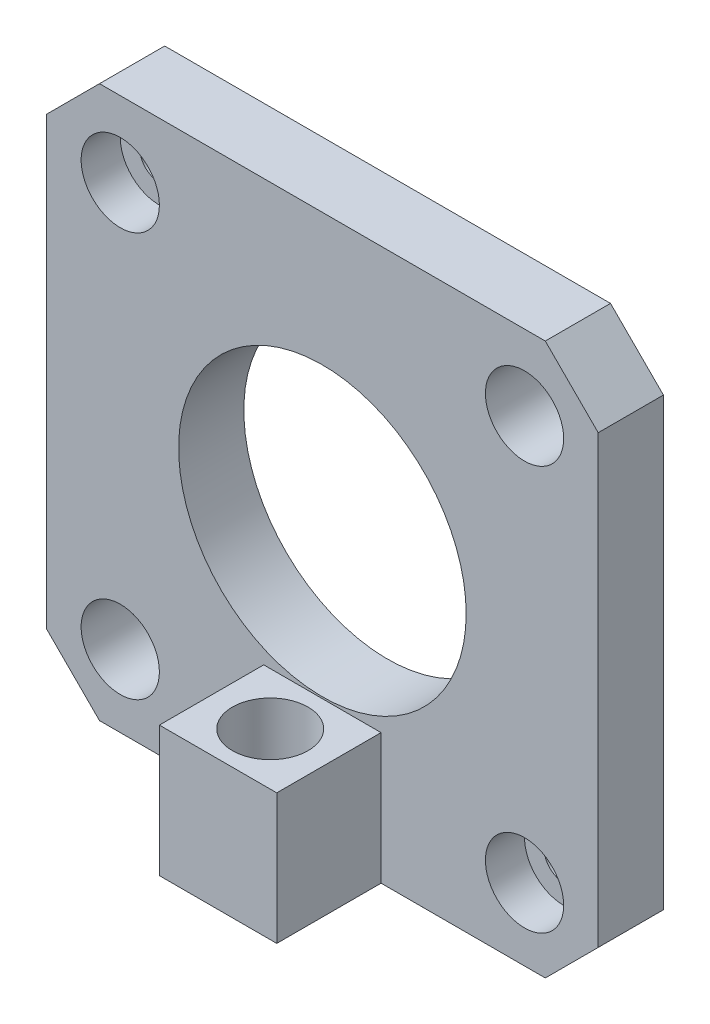
ISO-10303-21;
HEADER;
FILE_DESCRIPTION(('STEP AP214'),'2;1');
FILE_NAME('part.step','',(''),(''),'','','');
FILE_SCHEMA(('AUTOMOTIVE_DESIGN { 1 0 10303 214 1 1 1 1 }'));
ENDSEC;
DATA;
#1=APPLICATION_CONTEXT('core data for automotive mechanical design processes');
#2=APPLICATION_PROTOCOL_DEFINITION('international standard','automotive_design',2000,#1);
#3=PRODUCT_CONTEXT('',#1,'mechanical');
#4=PRODUCT('Part','Part','',(#3));
#5=PRODUCT_RELATED_PRODUCT_CATEGORY('part','',(#4));
#6=PRODUCT_DEFINITION_FORMATION('','',#4);
#7=PRODUCT_DEFINITION_CONTEXT('part definition',#1,'design');
#8=PRODUCT_DEFINITION('design','',#6,#7);
#9=PRODUCT_DEFINITION_SHAPE('','',#8);
#10=(LENGTH_UNIT() NAMED_UNIT(*) SI_UNIT(.MILLI.,.METRE.));
#11=(NAMED_UNIT(*) PLANE_ANGLE_UNIT() SI_UNIT($,.RADIAN.));
#12=(NAMED_UNIT(*) SI_UNIT($,.STERADIAN.) SOLID_ANGLE_UNIT());
#13=UNCERTAINTY_MEASURE_WITH_UNIT(LENGTH_MEASURE(1.E-05),#10,'distance_accuracy_value','');
#14=(GEOMETRIC_REPRESENTATION_CONTEXT(3) GLOBAL_UNCERTAINTY_ASSIGNED_CONTEXT((#13)) GLOBAL_UNIT_ASSIGNED_CONTEXT((#10,
#11,#12)) REPRESENTATION_CONTEXT('',''));
#15=CARTESIAN_POINT('',(0.,0.,0.));
#16=DIRECTION('',(0.,0.,1.));
#17=DIRECTION('',(1.,0.,0.));
#18=AXIS2_PLACEMENT_3D('',#15,#16,#17);
#19=CARTESIAN_POINT('',(-4.01755440247243E-12,-944.312865148015,2916.1615929941));
#20=DIRECTION('',(0.,0.,1.));
#21=DIRECTION('',(1.,0.,0.));
#22=AXIS2_PLACEMENT_3D('',#19,#20,#21);
#23=PLANE('',#22);
#24=CARTESIAN_POINT('',(15.499999999996,-928.812865148015,2916.1615929941));
#25=DIRECTION('',(0.,0.,1.));
#26=DIRECTION('',(1.,0.,0.));
#27=AXIS2_PLACEMENT_3D('',#24,#25,#26);
#28=CIRCLE('',#27,3.);
#29=CARTESIAN_POINT('',(18.499999999996,-928.812865148015,2916.1615929941));
#30=VERTEX_POINT('',#29);
#31=EDGE_CURVE('E240',#30,#30,#28,.T.);
#32=ORIENTED_EDGE('',*,*,#31,.F.);
#33=EDGE_LOOP('',(#32));
#34=FACE_BOUND('',#33,.T.);
#35=CARTESIAN_POINT('',(15.499999999996,-959.812865148015,2916.1615929941));
#36=DIRECTION('',(0.,0.,1.));
#37=DIRECTION('',(1.,0.,0.));
#38=AXIS2_PLACEMENT_3D('',#35,#36,#37);
#39=CIRCLE('',#38,3.);
#40=CARTESIAN_POINT('',(18.499999999996,-959.812865148015,2916.1615929941));
#41=VERTEX_POINT('',#40);
#42=EDGE_CURVE('E247',#41,#41,#39,.T.);
#43=ORIENTED_EDGE('',*,*,#42,.F.);
#44=EDGE_LOOP('',(#43));
#45=FACE_BOUND('',#44,.T.);
#46=CARTESIAN_POINT('',(-15.500000000004,-959.812865148015,2916.1615929941));
#47=DIRECTION('',(0.,0.,1.));
#48=DIRECTION('',(1.,0.,0.));
#49=AXIS2_PLACEMENT_3D('',#46,#47,#48);
#50=CIRCLE('',#49,3.);
#51=CARTESIAN_POINT('',(-12.500000000004,-959.812865148015,2916.1615929941));
#52=VERTEX_POINT('',#51);
#53=EDGE_CURVE('E239',#52,#52,#50,.T.);
#54=ORIENTED_EDGE('',*,*,#53,.F.);
#55=EDGE_LOOP('',(#54));
#56=FACE_BOUND('',#55,.T.);
#57=CARTESIAN_POINT('',(-15.500000000004,-928.812865148015,2916.1615929941));
#58=DIRECTION('',(0.,0.,1.));
#59=DIRECTION('',(1.,0.,0.));
#60=AXIS2_PLACEMENT_3D('',#57,#58,#59);
#61=CIRCLE('',#60,3.);
#62=CARTESIAN_POINT('',(-12.500000000004,-928.812865148015,2916.1615929941));
#63=VERTEX_POINT('',#62);
#64=EDGE_CURVE('E243',#63,#63,#61,.T.);
#65=ORIENTED_EDGE('',*,*,#64,.F.);
#66=EDGE_LOOP('',(#65));
#67=FACE_BOUND('',#66,.T.);
#68=DIRECTION('',(0.,-1.,0.));
#69=VECTOR('',#68,1.);
#70=CARTESIAN_POINT('',(-4.50000000000402,-965.341646842668,2916.1615929941));
#71=LINE('',#70,#69);
#72=CARTESIAN_POINT('',(-4.50000000000402,-955.341646842668,2916.1615929941));
#73=VERTEX_POINT('',#72);
#74=CARTESIAN_POINT('',(-4.50000000000402,-965.341646842668,2916.1615929941));
#75=VERTEX_POINT('',#74);
#76=EDGE_CURVE('E51',#73,#75,#71,.T.);
#77=ORIENTED_EDGE('',*,*,#76,.F.);
#78=DIRECTION('',(-1.,0.,0.));
#79=VECTOR('',#78,1.);
#80=CARTESIAN_POINT('',(-4.01755440247243E-12,-955.341646842668,2916.1615929941));
#81=LINE('',#80,#79);
#82=CARTESIAN_POINT('',(4.49999999999598,-955.341646842668,2916.1615929941));
#83=VERTEX_POINT('',#82);
#84=EDGE_CURVE('E143',#83,#73,#81,.T.);
#85=ORIENTED_EDGE('',*,*,#84,.F.);
#86=DIRECTION('',(0.,1.,0.));
#87=VECTOR('',#86,1.);
#88=CARTESIAN_POINT('',(4.49999999999598,-955.341646842668,2916.1615929941));
#89=LINE('',#88,#87);
#90=CARTESIAN_POINT('',(4.49999999999598,-965.341646842668,2916.1615929941));
#91=VERTEX_POINT('',#90);
#92=EDGE_CURVE('E57',#91,#83,#89,.T.);
#93=ORIENTED_EDGE('',*,*,#92,.F.);
#94=DIRECTION('',(1.,0.,0.));
#95=VECTOR('',#94,1.);
#96=CARTESIAN_POINT('',(-17.0917810538274,-965.341646842668,2916.1615929941));
#97=LINE('',#96,#95);
#98=CARTESIAN_POINT('',(17.0917810538194,-965.341646842668,2916.1615929941));
#99=VERTEX_POINT('',#98);
#100=EDGE_CURVE('E168',#91,#99,#97,.T.);
#101=ORIENTED_EDGE('',*,*,#100,.T.);
#102=DIRECTION('',(0.707106781186548,0.707106781186548,0.));
#103=VECTOR('',#102,1.);
#104=CARTESIAN_POINT('',(17.0917810538194,-965.341646842668,2916.1615929941));
#105=LINE('',#104,#103);
#106=CARTESIAN_POINT('',(21.149999999996,-961.283427896492,2916.1615929941));
#107=VERTEX_POINT('',#106);
#108=EDGE_CURVE('E171',#99,#107,#105,.T.);
#109=ORIENTED_EDGE('',*,*,#108,.T.);
#110=DIRECTION('',(0.,1.,0.));
#111=VECTOR('',#110,1.);
#112=CARTESIAN_POINT('',(21.149999999996,-961.283427896492,2916.1615929941));
#113=LINE('',#112,#111);
#114=CARTESIAN_POINT('',(21.149999999996,-927.099865788845,2916.1615929941));
#115=VERTEX_POINT('',#114);
#116=EDGE_CURVE('E173',#107,#115,#113,.T.);
#117=ORIENTED_EDGE('',*,*,#116,.T.);
#118=DIRECTION('',(-0.707106781186547,0.707106781186548,0.));
#119=VECTOR('',#118,1.);
#120=CARTESIAN_POINT('',(17.0917810538194,-923.041646842668,2916.1615929941));
#121=LINE('',#120,#119);
#122=CARTESIAN_POINT('',(17.0917810538194,-923.041646842668,2916.1615929941));
#123=VERTEX_POINT('',#122);
#124=EDGE_CURVE('E175',#115,#123,#121,.T.);
#125=ORIENTED_EDGE('',*,*,#124,.T.);
#126=DIRECTION('',(-1.,0.,0.));
#127=VECTOR('',#126,1.);
#128=CARTESIAN_POINT('',(-17.0917810538274,-923.041646842668,2916.1615929941));
#129=LINE('',#128,#127);
#130=CARTESIAN_POINT('',(-17.0917810538274,-923.041646842668,2916.1615929941));
#131=VERTEX_POINT('',#130);
#132=EDGE_CURVE('E158',#123,#131,#129,.T.);
#133=ORIENTED_EDGE('',*,*,#132,.T.);
#134=DIRECTION('',(-0.707106781186547,-0.707106781186548,0.));
#135=VECTOR('',#134,1.);
#136=CARTESIAN_POINT('',(-21.150000000004,-927.099865788845,2916.1615929941));
#137=LINE('',#136,#135);
#138=CARTESIAN_POINT('',(-21.150000000004,-927.099865788845,2916.1615929941));
#139=VERTEX_POINT('',#138);
#140=EDGE_CURVE('E161',#131,#139,#137,.T.);
#141=ORIENTED_EDGE('',*,*,#140,.T.);
#142=DIRECTION('',(0.,-1.,0.));
#143=VECTOR('',#142,1.);
#144=CARTESIAN_POINT('',(-21.150000000004,-961.283427896492,2916.1615929941));
#145=LINE('',#144,#143);
#146=CARTESIAN_POINT('',(-21.150000000004,-961.283427896492,2916.1615929941));
#147=VERTEX_POINT('',#146);
#148=EDGE_CURVE('E164',#139,#147,#145,.T.);
#149=ORIENTED_EDGE('',*,*,#148,.T.);
#150=DIRECTION('',(0.707106781186548,-0.707106781186548,0.));
#151=VECTOR('',#150,1.);
#152=CARTESIAN_POINT('',(-17.0917810538274,-965.341646842668,2916.1615929941));
#153=LINE('',#152,#151);
#154=CARTESIAN_POINT('',(-17.0917810538274,-965.341646842668,2916.1615929941));
#155=VERTEX_POINT('',#154);
#156=EDGE_CURVE('E166',#147,#155,#153,.T.);
#157=ORIENTED_EDGE('',*,*,#156,.T.);
#158=EDGE_CURVE('E169',#155,#75,#97,.T.);
#159=ORIENTED_EDGE('',*,*,#158,.T.);
#160=EDGE_LOOP('',(#77,#85,#93,#101,#109,#117,#125,#133,#141,#149,#157,#159));
#161=FACE_BOUND('',#160,.T.);
#162=CARTESIAN_POINT('',(-4.02110711615123E-12,-944.191646842668,2916.1615929941));
#163=DIRECTION('',(0.,0.,1.));
#164=DIRECTION('',(1.,0.,0.));
#165=AXIS2_PLACEMENT_3D('',#162,#163,#164);
#166=CIRCLE('',#165,11.025);
#167=CARTESIAN_POINT('',(11.024999999996,-944.191646842668,2916.1615929941));
#168=VERTEX_POINT('',#167);
#169=EDGE_CURVE('E149',#168,#168,#166,.T.);
#170=ORIENTED_EDGE('',*,*,#169,.F.);
#171=EDGE_LOOP('',(#170));
#172=FACE_BOUND('',#171,.T.);
#173=ADVANCED_FACE('F34',(#34,#45,#56,#67,#161,#172),#23,.T.);
#174=CARTESIAN_POINT('',(-4.01755440247243E-12,-944.312865148015,2911.1615929941));
#175=DIRECTION('',(0.,0.,1.));
#176=DIRECTION('',(1.,0.,0.));
#177=AXIS2_PLACEMENT_3D('',#174,#175,#176);
#178=PLANE('',#177);
#179=CARTESIAN_POINT('',(-15.500000000004,-959.812865148015,2911.1615929941));
#180=DIRECTION('',(0.,0.,1.));
#181=DIRECTION('',(1.,0.,0.));
#182=AXIS2_PLACEMENT_3D('',#179,#180,#181);
#183=CIRCLE('',#182,3.);
#184=CARTESIAN_POINT('',(-12.500000000004,-959.812865148015,2911.1615929941));
#185=VERTEX_POINT('',#184);
#186=EDGE_CURVE('E215',#185,#185,#183,.T.);
#187=ORIENTED_EDGE('',*,*,#186,.T.);
#188=EDGE_LOOP('',(#187));
#189=FACE_BOUND('',#188,.T.);
#190=CARTESIAN_POINT('',(15.499999999996,-928.812865148015,2911.1615929941));
#191=DIRECTION('',(0.,0.,1.));
#192=DIRECTION('',(1.,0.,0.));
#193=AXIS2_PLACEMENT_3D('',#190,#191,#192);
#194=CIRCLE('',#193,3.);
#195=CARTESIAN_POINT('',(18.499999999996,-928.812865148015,2911.1615929941));
#196=VERTEX_POINT('',#195);
#197=EDGE_CURVE('E212',#196,#196,#194,.T.);
#198=ORIENTED_EDGE('',*,*,#197,.T.);
#199=EDGE_LOOP('',(#198));
#200=FACE_BOUND('',#199,.T.);
#201=CARTESIAN_POINT('',(15.499999999996,-959.812865148015,2911.1615929941));
#202=DIRECTION('',(0.,0.,1.));
#203=DIRECTION('',(1.,0.,0.));
#204=AXIS2_PLACEMENT_3D('',#201,#202,#203);
#205=CIRCLE('',#204,1.5);
#206=CARTESIAN_POINT('',(16.999999999996,-959.812865148015,2911.1615929941));
#207=VERTEX_POINT('',#206);
#208=EDGE_CURVE('E230',#207,#207,#205,.T.);
#209=ORIENTED_EDGE('',*,*,#208,.T.);
#210=EDGE_LOOP('',(#209));
#211=FACE_BOUND('',#210,.T.);
#212=CARTESIAN_POINT('',(-15.500000000004,-928.812865148015,2911.1615929941));
#213=DIRECTION('',(0.,0.,1.));
#214=DIRECTION('',(1.,0.,0.));
#215=AXIS2_PLACEMENT_3D('',#212,#213,#214);
#216=CIRCLE('',#215,1.5);
#217=CARTESIAN_POINT('',(-14.000000000004,-928.812865148015,2911.1615929941));
#218=VERTEX_POINT('',#217);
#219=EDGE_CURVE('E236',#218,#218,#216,.T.);
#220=ORIENTED_EDGE('',*,*,#219,.T.);
#221=EDGE_LOOP('',(#220));
#222=FACE_BOUND('',#221,.T.);
#223=DIRECTION('',(-1.,0.,0.));
#224=VECTOR('',#223,1.);
#225=CARTESIAN_POINT('',(-17.0917810538274,-923.041646842668,2911.1615929941));
#226=LINE('',#225,#224);
#227=CARTESIAN_POINT('',(17.0917810538194,-923.041646842668,2911.1615929941));
#228=VERTEX_POINT('',#227);
#229=CARTESIAN_POINT('',(-17.0917810538274,-923.041646842668,2911.1615929941));
#230=VERTEX_POINT('',#229);
#231=EDGE_CURVE('E156',#228,#230,#226,.T.);
#232=ORIENTED_EDGE('',*,*,#231,.F.);
#233=DIRECTION('',(-0.707106781186547,0.707106781186548,0.));
#234=VECTOR('',#233,1.);
#235=CARTESIAN_POINT('',(17.0917810538194,-923.041646842668,2911.1615929941));
#236=LINE('',#235,#234);
#237=CARTESIAN_POINT('',(21.149999999996,-927.099865788845,2911.1615929941));
#238=VERTEX_POINT('',#237);
#239=EDGE_CURVE('E162',#238,#228,#236,.T.);
#240=ORIENTED_EDGE('',*,*,#239,.F.);
#241=DIRECTION('',(0.,1.,0.));
#242=VECTOR('',#241,1.);
#243=CARTESIAN_POINT('',(21.149999999996,-961.283427896492,2911.1615929941));
#244=LINE('',#243,#242);
#245=CARTESIAN_POINT('',(21.149999999996,-961.283427896492,2911.1615929941));
#246=VERTEX_POINT('',#245);
#247=EDGE_CURVE('E190',#246,#238,#244,.T.);
#248=ORIENTED_EDGE('',*,*,#247,.F.);
#249=DIRECTION('',(0.707106781186548,0.707106781186548,0.));
#250=VECTOR('',#249,1.);
#251=CARTESIAN_POINT('',(17.0917810538194,-965.341646842668,2911.1615929941));
#252=LINE('',#251,#250);
#253=CARTESIAN_POINT('',(17.0917810538194,-965.341646842668,2911.1615929941));
#254=VERTEX_POINT('',#253);
#255=EDGE_CURVE('E188',#254,#246,#252,.T.);
#256=ORIENTED_EDGE('',*,*,#255,.F.);
#257=DIRECTION('',(1.,0.,0.));
#258=VECTOR('',#257,1.);
#259=CARTESIAN_POINT('',(-17.0917810538274,-965.341646842668,2911.1615929941));
#260=LINE('',#259,#258);
#261=CARTESIAN_POINT('',(-17.0917810538274,-965.341646842668,2911.1615929941));
#262=VERTEX_POINT('',#261);
#263=EDGE_CURVE('E186',#262,#254,#260,.T.);
#264=ORIENTED_EDGE('',*,*,#263,.F.);
#265=DIRECTION('',(0.707106781186548,-0.707106781186548,0.));
#266=VECTOR('',#265,1.);
#267=CARTESIAN_POINT('',(-17.0917810538274,-965.341646842668,2911.1615929941));
#268=LINE('',#267,#266);
#269=CARTESIAN_POINT('',(-21.150000000004,-961.283427896492,2911.1615929941));
#270=VERTEX_POINT('',#269);
#271=EDGE_CURVE('E184',#270,#262,#268,.T.);
#272=ORIENTED_EDGE('',*,*,#271,.F.);
#273=DIRECTION('',(0.,-1.,0.));
#274=VECTOR('',#273,1.);
#275=CARTESIAN_POINT('',(-21.150000000004,-961.283427896492,2911.1615929941));
#276=LINE('',#275,#274);
#277=CARTESIAN_POINT('',(-21.150000000004,-927.099865788845,2911.1615929941));
#278=VERTEX_POINT('',#277);
#279=EDGE_CURVE('E182',#278,#270,#276,.T.);
#280=ORIENTED_EDGE('',*,*,#279,.F.);
#281=DIRECTION('',(-0.707106781186547,-0.707106781186548,0.));
#282=VECTOR('',#281,1.);
#283=CARTESIAN_POINT('',(-21.150000000004,-927.099865788845,2911.1615929941));
#284=LINE('',#283,#282);
#285=EDGE_CURVE('E180',#230,#278,#284,.T.);
#286=ORIENTED_EDGE('',*,*,#285,.F.);
#287=EDGE_LOOP('',(#232,#240,#248,#256,#264,#272,#280,#286));
#288=FACE_BOUND('',#287,.T.);
#289=CARTESIAN_POINT('',(-4.02110711615123E-12,-944.191646842668,2911.1615929941));
#290=DIRECTION('',(0.,0.,1.));
#291=DIRECTION('',(1.,0.,0.));
#292=AXIS2_PLACEMENT_3D('',#289,#290,#291);
#293=CIRCLE('',#292,11.025);
#294=CARTESIAN_POINT('',(11.024999999996,-944.191646842668,2911.1615929941));
#295=VERTEX_POINT('',#294);
#296=EDGE_CURVE('E146',#295,#295,#293,.T.);
#297=ORIENTED_EDGE('',*,*,#296,.T.);
#298=EDGE_LOOP('',(#297));
#299=FACE_BOUND('',#298,.T.);
#300=ADVANCED_FACE('F306',(#189,#200,#211,#222,#288,#299),#178,.F.);
#301=CARTESIAN_POINT('',(-17.0917810538274,-923.041646842668,2916.1615929941));
#302=DIRECTION('',(0.,-1.,0.));
#303=DIRECTION('',(0.,0.,-1.));
#304=AXIS2_PLACEMENT_3D('',#301,#302,#303);
#305=PLANE('',#304);
#306=ORIENTED_EDGE('',*,*,#231,.T.);
#307=DIRECTION('',(0.,0.,-1.));
#308=VECTOR('',#307,1.);
#309=CARTESIAN_POINT('',(-17.0917810538274,-923.041646842668,2916.1615929941));
#310=LINE('',#309,#308);
#311=EDGE_CURVE('E11',#131,#230,#310,.T.);
#312=ORIENTED_EDGE('',*,*,#311,.F.);
#313=ORIENTED_EDGE('',*,*,#132,.F.);
#314=DIRECTION('',(0.,0.,-1.));
#315=VECTOR('',#314,1.);
#316=CARTESIAN_POINT('',(17.0917810538194,-923.041646842668,2916.1615929941));
#317=LINE('',#316,#315);
#318=EDGE_CURVE('E177',#123,#228,#317,.T.);
#319=ORIENTED_EDGE('',*,*,#318,.T.);
#320=EDGE_LOOP('',(#306,#312,#313,#319));
#321=FACE_BOUND('',#320,.T.);
#322=ADVANCED_FACE('F36',(#321),#305,.F.);
#323=CARTESIAN_POINT('',(-21.150000000004,-927.099865788845,2916.1615929941));
#324=DIRECTION('',(0.707106781186548,-0.707106781186547,0.));
#325=DIRECTION('',(0.707106781186547,0.707106781186548,0.));
#326=AXIS2_PLACEMENT_3D('',#323,#324,#325);
#327=PLANE('',#326);
#328=ORIENTED_EDGE('',*,*,#285,.T.);
#329=DIRECTION('',(0.,0.,-1.));
#330=VECTOR('',#329,1.);
#331=CARTESIAN_POINT('',(-21.150000000004,-927.099865788845,2916.1615929941));
#332=LINE('',#331,#330);
#333=EDGE_CURVE('E43',#139,#278,#332,.T.);
#334=ORIENTED_EDGE('',*,*,#333,.F.);
#335=ORIENTED_EDGE('',*,*,#140,.F.);
#336=ORIENTED_EDGE('',*,*,#311,.T.);
#337=EDGE_LOOP('',(#328,#334,#335,#336));
#338=FACE_BOUND('',#337,.T.);
#339=ADVANCED_FACE('F292',(#338),#327,.F.);
#340=CARTESIAN_POINT('',(-21.150000000004,-961.283427896492,2916.1615929941));
#341=DIRECTION('',(1.,0.,0.));
#342=DIRECTION('',(0.,0.,-1.));
#343=AXIS2_PLACEMENT_3D('',#340,#341,#342);
#344=PLANE('',#343);
#345=ORIENTED_EDGE('',*,*,#279,.T.);
#346=DIRECTION('',(0.,0.,-1.));
#347=VECTOR('',#346,1.);
#348=CARTESIAN_POINT('',(-21.150000000004,-961.283427896492,2916.1615929941));
#349=LINE('',#348,#347);
#350=EDGE_CURVE('E207',#147,#270,#349,.T.);
#351=ORIENTED_EDGE('',*,*,#350,.F.);
#352=ORIENTED_EDGE('',*,*,#148,.F.);
#353=ORIENTED_EDGE('',*,*,#333,.T.);
#354=EDGE_LOOP('',(#345,#351,#352,#353));
#355=FACE_BOUND('',#354,.T.);
#356=ADVANCED_FACE('F297',(#355),#344,.F.);
#357=CARTESIAN_POINT('',(-17.0917810538274,-965.341646842668,2916.1615929941));
#358=DIRECTION('',(0.707106781186547,0.707106781186547,0.));
#359=DIRECTION('',(-0.707106781186548,0.707106781186548,0.));
#360=AXIS2_PLACEMENT_3D('',#357,#358,#359);
#361=PLANE('',#360);
#362=ORIENTED_EDGE('',*,*,#271,.T.);
#363=DIRECTION('',(0.,0.,-1.));
#364=VECTOR('',#363,1.);
#365=CARTESIAN_POINT('',(-17.0917810538274,-965.341646842668,2916.1615929941));
#366=LINE('',#365,#364);
#367=EDGE_CURVE('E204',#155,#262,#366,.T.);
#368=ORIENTED_EDGE('',*,*,#367,.F.);
#369=ORIENTED_EDGE('',*,*,#156,.F.);
#370=ORIENTED_EDGE('',*,*,#350,.T.);
#371=EDGE_LOOP('',(#362,#368,#369,#370));
#372=FACE_BOUND('',#371,.T.);
#373=ADVANCED_FACE('F302',(#372),#361,.F.);
#374=CARTESIAN_POINT('',(-17.0917810538274,-965.341646842668,2916.1615929941));
#375=DIRECTION('',(0.,1.,0.));
#376=DIRECTION('',(0.,0.,1.));
#377=AXIS2_PLACEMENT_3D('',#374,#375,#376);
#378=PLANE('',#377);
#379=CARTESIAN_POINT('',(-4.01666622405273E-12,-965.341646842668,2920.1615929941));
#380=DIRECTION('',(0.,-1.,0.));
#381=DIRECTION('',(0.,0.,-1.));
#382=AXIS2_PLACEMENT_3D('',#379,#380,#381);
#383=CIRCLE('',#382,2.9);
#384=CARTESIAN_POINT('',(-4.01666622405273E-12,-965.341646842668,2917.2615929941));
#385=VERTEX_POINT('',#384);
#386=EDGE_CURVE('E220',#385,#385,#383,.T.);
#387=ORIENTED_EDGE('',*,*,#386,.F.);
#388=EDGE_LOOP('',(#387));
#389=FACE_BOUND('',#388,.T.);
#390=ORIENTED_EDGE('',*,*,#263,.T.);
#391=DIRECTION('',(0.,0.,-1.));
#392=VECTOR('',#391,1.);
#393=CARTESIAN_POINT('',(17.0917810538194,-965.341646842668,2916.1615929941));
#394=LINE('',#393,#392);
#395=EDGE_CURVE('E201',#99,#254,#394,.T.);
#396=ORIENTED_EDGE('',*,*,#395,.F.);
#397=ORIENTED_EDGE('',*,*,#100,.F.);
#398=DIRECTION('',(0.,0.,-1.));
#399=VECTOR('',#398,1.);
#400=CARTESIAN_POINT('',(4.49999999999598,-965.341646842668,2924.1615929941));
#401=LINE('',#400,#399);
#402=CARTESIAN_POINT('',(4.49999999999598,-965.341646842668,2924.1615929941));
#403=VERTEX_POINT('',#402);
#404=EDGE_CURVE('E151',#403,#91,#401,.T.);
#405=ORIENTED_EDGE('',*,*,#404,.F.);
#406=DIRECTION('',(1.,0.,0.));
#407=VECTOR('',#406,1.);
#408=CARTESIAN_POINT('',(4.49999999999598,-965.341646842668,2924.1615929941));
#409=LINE('',#408,#407);
#410=CARTESIAN_POINT('',(-4.50000000000402,-965.341646842668,2924.1615929941));
#411=VERTEX_POINT('',#410);
#412=EDGE_CURVE('E133',#411,#403,#409,.T.);
#413=ORIENTED_EDGE('',*,*,#412,.F.);
#414=DIRECTION('',(0.,0.,-1.));
#415=VECTOR('',#414,1.);
#416=CARTESIAN_POINT('',(-4.50000000000402,-965.341646842668,2924.1615929941));
#417=LINE('',#416,#415);
#418=EDGE_CURVE('E130',#411,#75,#417,.T.);
#419=ORIENTED_EDGE('',*,*,#418,.T.);
#420=ORIENTED_EDGE('',*,*,#158,.F.);
#421=ORIENTED_EDGE('',*,*,#367,.T.);
#422=EDGE_LOOP('',(#390,#396,#397,#405,#413,#419,#420,#421));
#423=FACE_BOUND('',#422,.T.);
#424=ADVANCED_FACE('F268',(#389,#423),#378,.F.);
#425=CARTESIAN_POINT('',(17.0917810538194,-965.341646842668,2916.1615929941));
#426=DIRECTION('',(-0.707106781186547,0.707106781186547,0.));
#427=DIRECTION('',(-0.707106781186548,-0.707106781186548,0.));
#428=AXIS2_PLACEMENT_3D('',#425,#426,#427);
#429=PLANE('',#428);
#430=ORIENTED_EDGE('',*,*,#255,.T.);
#431=DIRECTION('',(0.,0.,-1.));
#432=VECTOR('',#431,1.);
#433=CARTESIAN_POINT('',(21.149999999996,-961.283427896492,2916.1615929941));
#434=LINE('',#433,#432);
#435=EDGE_CURVE('E198',#107,#246,#434,.T.);
#436=ORIENTED_EDGE('',*,*,#435,.F.);
#437=ORIENTED_EDGE('',*,*,#108,.F.);
#438=ORIENTED_EDGE('',*,*,#395,.T.);
#439=EDGE_LOOP('',(#430,#436,#437,#438));
#440=FACE_BOUND('',#439,.T.);
#441=ADVANCED_FACE('F276',(#440),#429,.F.);
#442=CARTESIAN_POINT('',(21.149999999996,-961.283427896492,2916.1615929941));
#443=DIRECTION('',(-1.,0.,0.));
#444=DIRECTION('',(0.,0.,1.));
#445=AXIS2_PLACEMENT_3D('',#442,#443,#444);
#446=PLANE('',#445);
#447=ORIENTED_EDGE('',*,*,#247,.T.);
#448=DIRECTION('',(0.,0.,-1.));
#449=VECTOR('',#448,1.);
#450=CARTESIAN_POINT('',(21.149999999996,-927.099865788845,2916.1615929941));
#451=LINE('',#450,#449);
#452=EDGE_CURVE('E195',#115,#238,#451,.T.);
#453=ORIENTED_EDGE('',*,*,#452,.F.);
#454=ORIENTED_EDGE('',*,*,#116,.F.);
#455=ORIENTED_EDGE('',*,*,#435,.T.);
#456=EDGE_LOOP('',(#447,#453,#454,#455));
#457=FACE_BOUND('',#456,.T.);
#458=ADVANCED_FACE('F280',(#457),#446,.F.);
#459=CARTESIAN_POINT('',(17.0917810538194,-923.041646842668,2916.1615929941));
#460=DIRECTION('',(-0.707106781186548,-0.707106781186547,0.));
#461=DIRECTION('',(0.707106781186547,-0.707106781186548,0.));
#462=AXIS2_PLACEMENT_3D('',#459,#460,#461);
#463=PLANE('',#462);
#464=ORIENTED_EDGE('',*,*,#239,.T.);
#465=ORIENTED_EDGE('',*,*,#318,.F.);
#466=ORIENTED_EDGE('',*,*,#124,.F.);
#467=ORIENTED_EDGE('',*,*,#452,.T.);
#468=EDGE_LOOP('',(#464,#465,#466,#467));
#469=FACE_BOUND('',#468,.T.);
#470=ADVANCED_FACE('F285',(#469),#463,.F.);
#471=CARTESIAN_POINT('',(-4.02110711615123E-12,-944.191646842668,2916.1615929941));
#472=DIRECTION('',(0.,0.,-1.));
#473=DIRECTION('',(-1.,0.,0.));
#474=AXIS2_PLACEMENT_3D('',#471,#472,#473);
#475=CYLINDRICAL_SURFACE('',#474,11.025);
#476=ORIENTED_EDGE('',*,*,#169,.T.);
#477=EDGE_LOOP('',(#476));
#478=FACE_BOUND('',#477,.T.);
#479=ORIENTED_EDGE('',*,*,#296,.F.);
#480=EDGE_LOOP('',(#479));
#481=FACE_BOUND('',#480,.T.);
#482=ADVANCED_FACE('F312',(#478,#481),#475,.F.);
#483=CARTESIAN_POINT('',(-4.50000000000402,-965.341646842668,2924.1615929941));
#484=DIRECTION('',(1.,0.,0.));
#485=DIRECTION('',(0.,0.,-1.));
#486=AXIS2_PLACEMENT_3D('',#483,#484,#485);
#487=PLANE('',#486);
#488=ORIENTED_EDGE('',*,*,#76,.T.);
#489=ORIENTED_EDGE('',*,*,#418,.F.);
#490=DIRECTION('',(0.,-1.,0.));
#491=VECTOR('',#490,1.);
#492=CARTESIAN_POINT('',(-4.50000000000402,-965.341646842668,2924.1615929941));
#493=LINE('',#492,#491);
#494=CARTESIAN_POINT('',(-4.50000000000402,-955.341646842668,2924.1615929941));
#495=VERTEX_POINT('',#494);
#496=EDGE_CURVE('E124',#495,#411,#493,.T.);
#497=ORIENTED_EDGE('',*,*,#496,.F.);
#498=DIRECTION('',(0.,0.,-1.));
#499=VECTOR('',#498,1.);
#500=CARTESIAN_POINT('',(-4.50000000000402,-955.341646842668,2924.1615929941));
#501=LINE('',#500,#499);
#502=EDGE_CURVE('E128',#495,#73,#501,.T.);
#503=ORIENTED_EDGE('',*,*,#502,.T.);
#504=EDGE_LOOP('',(#488,#489,#497,#503));
#505=FACE_BOUND('',#504,.T.);
#506=ADVANCED_FACE('F126',(#505),#487,.F.);
#507=CARTESIAN_POINT('',(4.49999999999598,-955.341646842668,2924.1615929941));
#508=DIRECTION('',(-1.,0.,0.));
#509=DIRECTION('',(0.,0.,1.));
#510=AXIS2_PLACEMENT_3D('',#507,#508,#509);
#511=PLANE('',#510);
#512=ORIENTED_EDGE('',*,*,#92,.T.);
#513=DIRECTION('',(0.,0.,-1.));
#514=VECTOR('',#513,1.);
#515=CARTESIAN_POINT('',(4.49999999999598,-955.341646842668,2924.1615929941));
#516=LINE('',#515,#514);
#517=CARTESIAN_POINT('',(4.49999999999598,-955.341646842668,2924.1615929941));
#518=VERTEX_POINT('',#517);
#519=EDGE_CURVE('E259',#518,#83,#516,.T.);
#520=ORIENTED_EDGE('',*,*,#519,.F.);
#521=DIRECTION('',(0.,1.,0.));
#522=VECTOR('',#521,1.);
#523=CARTESIAN_POINT('',(4.49999999999598,-955.341646842668,2924.1615929941));
#524=LINE('',#523,#522);
#525=EDGE_CURVE('E139',#403,#518,#524,.T.);
#526=ORIENTED_EDGE('',*,*,#525,.F.);
#527=ORIENTED_EDGE('',*,*,#404,.T.);
#528=EDGE_LOOP('',(#512,#520,#526,#527));
#529=FACE_BOUND('',#528,.T.);
#530=ADVANCED_FACE('F266',(#529),#511,.F.);
#531=CARTESIAN_POINT('',(-4.01755440247243E-12,-955.341646842668,2924.1615929941));
#532=DIRECTION('',(0.,-1.,0.));
#533=DIRECTION('',(0.,0.,-1.));
#534=AXIS2_PLACEMENT_3D('',#531,#532,#533);
#535=PLANE('',#534);
#536=CARTESIAN_POINT('',(-4.01666622405273E-12,-955.341646842668,2920.1615929941));
#537=DIRECTION('',(0.,-1.,0.));
#538=DIRECTION('',(0.,0.,-1.));
#539=AXIS2_PLACEMENT_3D('',#536,#537,#538);
#540=CIRCLE('',#539,2.9);
#541=CARTESIAN_POINT('',(-4.01666622405273E-12,-955.341646842668,2917.2615929941));
#542=VERTEX_POINT('',#541);
#543=EDGE_CURVE('E38',#542,#542,#540,.T.);
#544=ORIENTED_EDGE('',*,*,#543,.T.);
#545=EDGE_LOOP('',(#544));
#546=FACE_BOUND('',#545,.T.);
#547=ORIENTED_EDGE('',*,*,#84,.T.);
#548=ORIENTED_EDGE('',*,*,#502,.F.);
#549=DIRECTION('',(-1.,0.,0.));
#550=VECTOR('',#549,1.);
#551=CARTESIAN_POINT('',(-4.50000000000402,-955.341646842668,2924.1615929941));
#552=LINE('',#551,#550);
#553=EDGE_CURVE('E134',#518,#495,#552,.T.);
#554=ORIENTED_EDGE('',*,*,#553,.F.);
#555=ORIENTED_EDGE('',*,*,#519,.T.);
#556=EDGE_LOOP('',(#547,#548,#554,#555));
#557=FACE_BOUND('',#556,.T.);
#558=ADVANCED_FACE('F145',(#546,#557),#535,.F.);
#559=CARTESIAN_POINT('',(-4.01755440247243E-12,-944.312865148015,2924.1615929941));
#560=DIRECTION('',(0.,0.,-1.));
#561=DIRECTION('',(-1.,0.,0.));
#562=AXIS2_PLACEMENT_3D('',#559,#560,#561);
#563=PLANE('',#562);
#564=ORIENTED_EDGE('',*,*,#553,.T.);
#565=ORIENTED_EDGE('',*,*,#496,.T.);
#566=ORIENTED_EDGE('',*,*,#412,.T.);
#567=ORIENTED_EDGE('',*,*,#525,.T.);
#568=EDGE_LOOP('',(#564,#565,#566,#567));
#569=FACE_BOUND('',#568,.T.);
#570=ADVANCED_FACE('F137',(#569),#563,.F.);
#571=CARTESIAN_POINT('',(-15.500000000004,-928.812865148015,2913.1615929941));
#572=DIRECTION('',(0.,0.,1.));
#573=DIRECTION('',(1.,0.,0.));
#574=AXIS2_PLACEMENT_3D('',#571,#572,#573);
#575=CYLINDRICAL_SURFACE('',#574,3.);
#576=CARTESIAN_POINT('',(-15.500000000004,-928.812865148015,2913.1615929941));
#577=DIRECTION('',(0.,0.,1.));
#578=DIRECTION('',(1.,0.,0.));
#579=AXIS2_PLACEMENT_3D('',#576,#577,#578);
#580=CIRCLE('',#579,3.);
#581=CARTESIAN_POINT('',(-12.500000000004,-928.812865148015,2913.1615929941));
#582=VERTEX_POINT('',#581);
#583=EDGE_CURVE('E252',#582,#582,#580,.T.);
#584=ORIENTED_EDGE('',*,*,#583,.F.);
#585=EDGE_LOOP('',(#584));
#586=FACE_BOUND('',#585,.T.);
#587=ORIENTED_EDGE('',*,*,#64,.T.);
#588=EDGE_LOOP('',(#587));
#589=FACE_BOUND('',#588,.T.);
#590=ADVANCED_FACE('F428',(#586,#589),#575,.F.);
#591=CARTESIAN_POINT('',(-15.500000000004,-928.812865148015,2913.1615929941));
#592=DIRECTION('',(0.,0.,1.));
#593=DIRECTION('',(1.,0.,0.));
#594=AXIS2_PLACEMENT_3D('',#591,#592,#593);
#595=PLANE('',#594);
#596=CARTESIAN_POINT('',(-15.500000000004,-928.812865148015,2913.1615929941));
#597=DIRECTION('',(0.,0.,1.));
#598=DIRECTION('',(1.,0.,0.));
#599=AXIS2_PLACEMENT_3D('',#596,#597,#598);
#600=CIRCLE('',#599,1.5);
#601=CARTESIAN_POINT('',(-14.000000000004,-928.812865148015,2913.1615929941));
#602=VERTEX_POINT('',#601);
#603=EDGE_CURVE('E233',#602,#602,#600,.T.);
#604=ORIENTED_EDGE('',*,*,#603,.F.);
#605=EDGE_LOOP('',(#604));
#606=FACE_BOUND('',#605,.T.);
#607=ORIENTED_EDGE('',*,*,#583,.T.);
#608=EDGE_LOOP('',(#607));
#609=FACE_BOUND('',#608,.T.);
#610=ADVANCED_FACE('F437',(#606,#609),#595,.T.);
#611=CARTESIAN_POINT('',(-15.500000000004,-959.812865148015,2913.1615929941));
#612=DIRECTION('',(0.,0.,1.));
#613=DIRECTION('',(1.,0.,0.));
#614=AXIS2_PLACEMENT_3D('',#611,#612,#613);
#615=CYLINDRICAL_SURFACE('',#614,3.);
#616=ORIENTED_EDGE('',*,*,#53,.T.);
#617=EDGE_LOOP('',(#616));
#618=FACE_BOUND('',#617,.T.);
#619=ORIENTED_EDGE('',*,*,#186,.F.);
#620=EDGE_LOOP('',(#619));
#621=FACE_BOUND('',#620,.T.);
#622=ADVANCED_FACE('F447',(#618,#621),#615,.F.);
#623=CARTESIAN_POINT('',(15.499999999996,-959.812865148015,2913.1615929941));
#624=DIRECTION('',(0.,0.,1.));
#625=DIRECTION('',(1.,0.,0.));
#626=AXIS2_PLACEMENT_3D('',#623,#624,#625);
#627=CYLINDRICAL_SURFACE('',#626,3.);
#628=CARTESIAN_POINT('',(15.499999999996,-959.812865148015,2913.1615929941));
#629=DIRECTION('',(0.,0.,1.));
#630=DIRECTION('',(1.,0.,0.));
#631=AXIS2_PLACEMENT_3D('',#628,#629,#630);
#632=CIRCLE('',#631,3.);
#633=CARTESIAN_POINT('',(18.499999999996,-959.812865148015,2913.1615929941));
#634=VERTEX_POINT('',#633);
#635=EDGE_CURVE('E244',#634,#634,#632,.T.);
#636=ORIENTED_EDGE('',*,*,#635,.F.);
#637=EDGE_LOOP('',(#636));
#638=FACE_BOUND('',#637,.T.);
#639=ORIENTED_EDGE('',*,*,#42,.T.);
#640=EDGE_LOOP('',(#639));
#641=FACE_BOUND('',#640,.T.);
#642=ADVANCED_FACE('F458',(#638,#641),#627,.F.);
#643=CARTESIAN_POINT('',(15.499999999996,-959.812865148015,2913.1615929941));
#644=DIRECTION('',(0.,0.,1.));
#645=DIRECTION('',(1.,0.,0.));
#646=AXIS2_PLACEMENT_3D('',#643,#644,#645);
#647=PLANE('',#646);
#648=CARTESIAN_POINT('',(15.499999999996,-959.812865148015,2913.1615929941));
#649=DIRECTION('',(0.,0.,1.));
#650=DIRECTION('',(1.,0.,0.));
#651=AXIS2_PLACEMENT_3D('',#648,#649,#650);
#652=CIRCLE('',#651,1.5);
#653=CARTESIAN_POINT('',(16.999999999996,-959.812865148015,2913.1615929941));
#654=VERTEX_POINT('',#653);
#655=EDGE_CURVE('E214',#654,#654,#652,.T.);
#656=ORIENTED_EDGE('',*,*,#655,.F.);
#657=EDGE_LOOP('',(#656));
#658=FACE_BOUND('',#657,.T.);
#659=ORIENTED_EDGE('',*,*,#635,.T.);
#660=EDGE_LOOP('',(#659));
#661=FACE_BOUND('',#660,.T.);
#662=ADVANCED_FACE('F470',(#658,#661),#647,.T.);
#663=CARTESIAN_POINT('',(15.499999999996,-928.812865148015,2913.1615929941));
#664=DIRECTION('',(0.,0.,1.));
#665=DIRECTION('',(1.,0.,0.));
#666=AXIS2_PLACEMENT_3D('',#663,#664,#665);
#667=CYLINDRICAL_SURFACE('',#666,3.);
#668=ORIENTED_EDGE('',*,*,#31,.T.);
#669=EDGE_LOOP('',(#668));
#670=FACE_BOUND('',#669,.T.);
#671=ORIENTED_EDGE('',*,*,#197,.F.);
#672=EDGE_LOOP('',(#671));
#673=FACE_BOUND('',#672,.T.);
#674=ADVANCED_FACE('F480',(#670,#673),#667,.F.);
#675=CARTESIAN_POINT('',(-15.500000000004,-928.812865148015,2910.1615929941));
#676=DIRECTION('',(0.,0.,1.));
#677=DIRECTION('',(1.,0.,0.));
#678=AXIS2_PLACEMENT_3D('',#675,#676,#677);
#679=CYLINDRICAL_SURFACE('',#678,1.5);
#680=ORIENTED_EDGE('',*,*,#603,.T.);
#681=EDGE_LOOP('',(#680));
#682=FACE_BOUND('',#681,.T.);
#683=ORIENTED_EDGE('',*,*,#219,.F.);
#684=EDGE_LOOP('',(#683));
#685=FACE_BOUND('',#684,.T.);
#686=ADVANCED_FACE('F490',(#682,#685),#679,.F.);
#687=CARTESIAN_POINT('',(15.499999999996,-959.812865148015,2910.1615929941));
#688=DIRECTION('',(0.,0.,1.));
#689=DIRECTION('',(1.,0.,0.));
#690=AXIS2_PLACEMENT_3D('',#687,#688,#689);
#691=CYLINDRICAL_SURFACE('',#690,1.5);
#692=ORIENTED_EDGE('',*,*,#655,.T.);
#693=EDGE_LOOP('',(#692));
#694=FACE_BOUND('',#693,.T.);
#695=ORIENTED_EDGE('',*,*,#208,.F.);
#696=EDGE_LOOP('',(#695));
#697=FACE_BOUND('',#696,.T.);
#698=ADVANCED_FACE('F501',(#694,#697),#691,.F.);
#699=CARTESIAN_POINT('',(-4.01666622405273E-12,-953.323646842668,2920.1615929941));
#700=DIRECTION('',(0.,-1.,0.));
#701=DIRECTION('',(0.,0.,-1.));
#702=AXIS2_PLACEMENT_3D('',#699,#700,#701);
#703=CYLINDRICAL_SURFACE('',#702,2.9);
#704=ORIENTED_EDGE('',*,*,#386,.T.);
#705=EDGE_LOOP('',(#704));
#706=FACE_BOUND('',#705,.T.);
#707=ORIENTED_EDGE('',*,*,#543,.F.);
#708=EDGE_LOOP('',(#707));
#709=FACE_BOUND('',#708,.T.);
#710=ADVANCED_FACE('F510',(#706,#709),#703,.F.);
#711=CLOSED_SHELL('',(#173,#300,#322,#339,#356,#373,#424,#441,#458,#470,#482,#506,#530,#558,
#570,#590,#610,#622,#642,#662,#674,#686,#698,#710));
#712=MANIFOLD_SOLID_BREP('B2',#711);
#713=ADVANCED_BREP_SHAPE_REPRESENTATION('',(#18,#712),#14);
#714=SHAPE_DEFINITION_REPRESENTATION(#9,#713);
ENDSEC;
END-ISO-10303-21;
